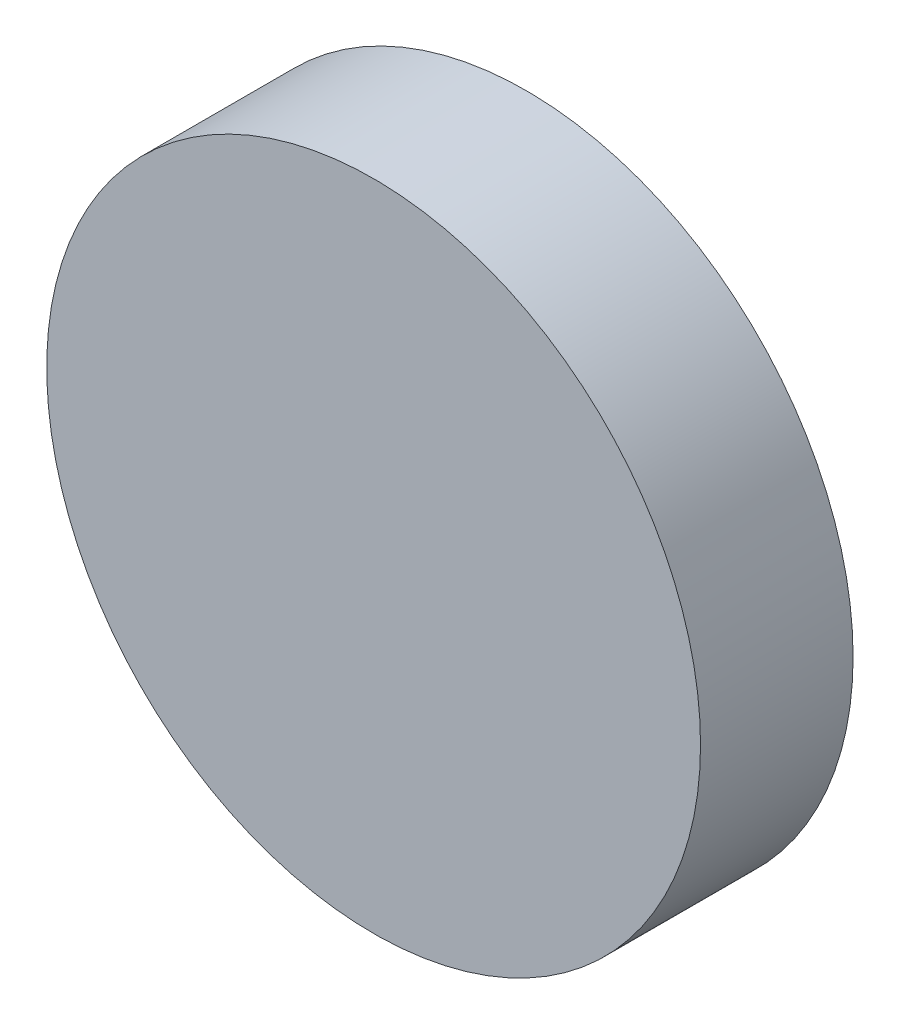
ISO-10303-21;
HEADER;
FILE_DESCRIPTION(('STEP AP214'),'2;1');
FILE_NAME('part.step','',(''),(''),'','','');
FILE_SCHEMA(('AUTOMOTIVE_DESIGN { 1 0 10303 214 1 1 1 1 }'));
ENDSEC;
DATA;
#1=APPLICATION_CONTEXT('core data for automotive mechanical design processes');
#2=APPLICATION_PROTOCOL_DEFINITION('international standard','automotive_design',2000,#1);
#3=PRODUCT_CONTEXT('',#1,'mechanical');
#4=PRODUCT('Part','Part','',(#3));
#5=PRODUCT_RELATED_PRODUCT_CATEGORY('part','',(#4));
#6=PRODUCT_DEFINITION_FORMATION('','',#4);
#7=PRODUCT_DEFINITION_CONTEXT('part definition',#1,'design');
#8=PRODUCT_DEFINITION('design','',#6,#7);
#9=PRODUCT_DEFINITION_SHAPE('','',#8);
#10=(LENGTH_UNIT() NAMED_UNIT(*) SI_UNIT(.MILLI.,.METRE.));
#11=(NAMED_UNIT(*) PLANE_ANGLE_UNIT() SI_UNIT($,.RADIAN.));
#12=(NAMED_UNIT(*) SI_UNIT($,.STERADIAN.) SOLID_ANGLE_UNIT());
#13=UNCERTAINTY_MEASURE_WITH_UNIT(LENGTH_MEASURE(1.E-05),#10,'distance_accuracy_value','');
#14=(GEOMETRIC_REPRESENTATION_CONTEXT(3) GLOBAL_UNCERTAINTY_ASSIGNED_CONTEXT((#13)) GLOBAL_UNIT_ASSIGNED_CONTEXT((#10,
#11,#12)) REPRESENTATION_CONTEXT('',''));
#15=CARTESIAN_POINT('',(0.,0.,0.));
#16=DIRECTION('',(0.,0.,1.));
#17=DIRECTION('',(1.,0.,0.));
#18=AXIS2_PLACEMENT_3D('',#15,#16,#17);
#19=CARTESIAN_POINT('',(0.,0.,0.));
#20=DIRECTION('',(0.,0.,1.));
#21=DIRECTION('',(1.,0.,0.));
#22=AXIS2_PLACEMENT_3D('',#19,#20,#21);
#23=PLANE('',#22);
#24=CARTESIAN_POINT('',(0.,0.,0.));
#25=DIRECTION('',(0.,0.,1.));
#26=DIRECTION('',(1.,0.,0.));
#27=AXIS2_PLACEMENT_3D('',#24,#25,#26);
#28=CIRCLE('',#27,7.5);
#29=CARTESIAN_POINT('',(7.5,0.,0.));
#30=VERTEX_POINT('',#29);
#31=EDGE_CURVE('E10',#30,#30,#28,.T.);
#32=ORIENTED_EDGE('',*,*,#31,.F.);
#33=EDGE_LOOP('',(#32));
#34=FACE_BOUND('',#33,.T.);
#35=CARTESIAN_POINT('',(0.,0.,0.));
#36=DIRECTION('',(0.,0.,1.));
#37=DIRECTION('',(1.,0.,0.));
#38=AXIS2_PLACEMENT_3D('',#35,#36,#37);
#39=CIRCLE('',#38,5.);
#40=CARTESIAN_POINT('',(5.,0.,0.));
#41=VERTEX_POINT('',#40);
#42=EDGE_CURVE('E42',#41,#41,#39,.T.);
#43=ORIENTED_EDGE('',*,*,#42,.T.);
#44=EDGE_LOOP('',(#43));
#45=FACE_BOUND('',#44,.T.);
#46=ADVANCED_FACE('F35',(#34,#45),#23,.F.);
#47=CARTESIAN_POINT('',(0.,0.,2.));
#48=DIRECTION('',(0.,0.,-1.));
#49=DIRECTION('',(-1.,0.,0.));
#50=AXIS2_PLACEMENT_3D('',#47,#48,#49);
#51=CYLINDRICAL_SURFACE('',#50,7.5);
#52=ORIENTED_EDGE('',*,*,#31,.T.);
#53=EDGE_LOOP('',(#52));
#54=FACE_BOUND('',#53,.T.);
#55=CARTESIAN_POINT('',(0.,0.,3.5));
#56=DIRECTION('',(0.,0.,1.));
#57=DIRECTION('',(1.,0.,0.));
#58=AXIS2_PLACEMENT_3D('',#55,#56,#57);
#59=CIRCLE('',#58,7.5);
#60=CARTESIAN_POINT('',(7.5,0.,3.5));
#61=VERTEX_POINT('',#60);
#62=EDGE_CURVE('E50',#61,#61,#59,.T.);
#63=ORIENTED_EDGE('',*,*,#62,.F.);
#64=EDGE_LOOP('',(#63));
#65=FACE_BOUND('',#64,.T.);
#66=ADVANCED_FACE('F37',(#54,#65),#51,.T.);
#67=CARTESIAN_POINT('',(0.,0.,2.));
#68=DIRECTION('',(0.,0.,-1.));
#69=DIRECTION('',(-1.,0.,0.));
#70=AXIS2_PLACEMENT_3D('',#67,#68,#69);
#71=CYLINDRICAL_SURFACE('',#70,5.);
#72=CARTESIAN_POINT('',(0.,0.,2.));
#73=DIRECTION('',(0.,0.,1.));
#74=DIRECTION('',(1.,0.,0.));
#75=AXIS2_PLACEMENT_3D('',#72,#73,#74);
#76=CIRCLE('',#75,5.);
#77=CARTESIAN_POINT('',(5.,0.,2.));
#78=VERTEX_POINT('',#77);
#79=EDGE_CURVE('E46',#78,#78,#76,.T.);
#80=ORIENTED_EDGE('',*,*,#79,.T.);
#81=EDGE_LOOP('',(#80));
#82=FACE_BOUND('',#81,.T.);
#83=ORIENTED_EDGE('',*,*,#42,.F.);
#84=EDGE_LOOP('',(#83));
#85=FACE_BOUND('',#84,.T.);
#86=ADVANCED_FACE('F59',(#82,#85),#71,.F.);
#87=CARTESIAN_POINT('',(0.,0.,2.));
#88=DIRECTION('',(0.,0.,1.));
#89=DIRECTION('',(1.,0.,0.));
#90=AXIS2_PLACEMENT_3D('',#87,#88,#89);
#91=PLANE('',#90);
#92=ORIENTED_EDGE('',*,*,#79,.F.);
#93=EDGE_LOOP('',(#92));
#94=FACE_BOUND('',#93,.T.);
#95=ADVANCED_FACE('F64',(#94),#91,.F.);
#96=CARTESIAN_POINT('',(0.,0.,3.5));
#97=DIRECTION('',(0.,0.,1.));
#98=DIRECTION('',(1.,0.,0.));
#99=AXIS2_PLACEMENT_3D('',#96,#97,#98);
#100=PLANE('',#99);
#101=ORIENTED_EDGE('',*,*,#62,.T.);
#102=EDGE_LOOP('',(#101));
#103=FACE_BOUND('',#102,.T.);
#104=ADVANCED_FACE('F56',(#103),#100,.T.);
#105=CLOSED_SHELL('',(#46,#66,#86,#95,#104));
#106=MANIFOLD_SOLID_BREP('B2',#105);
#107=ADVANCED_BREP_SHAPE_REPRESENTATION('',(#18,#106),#14);
#108=SHAPE_DEFINITION_REPRESENTATION(#9,#107);
ENDSEC;
END-ISO-10303-21;
